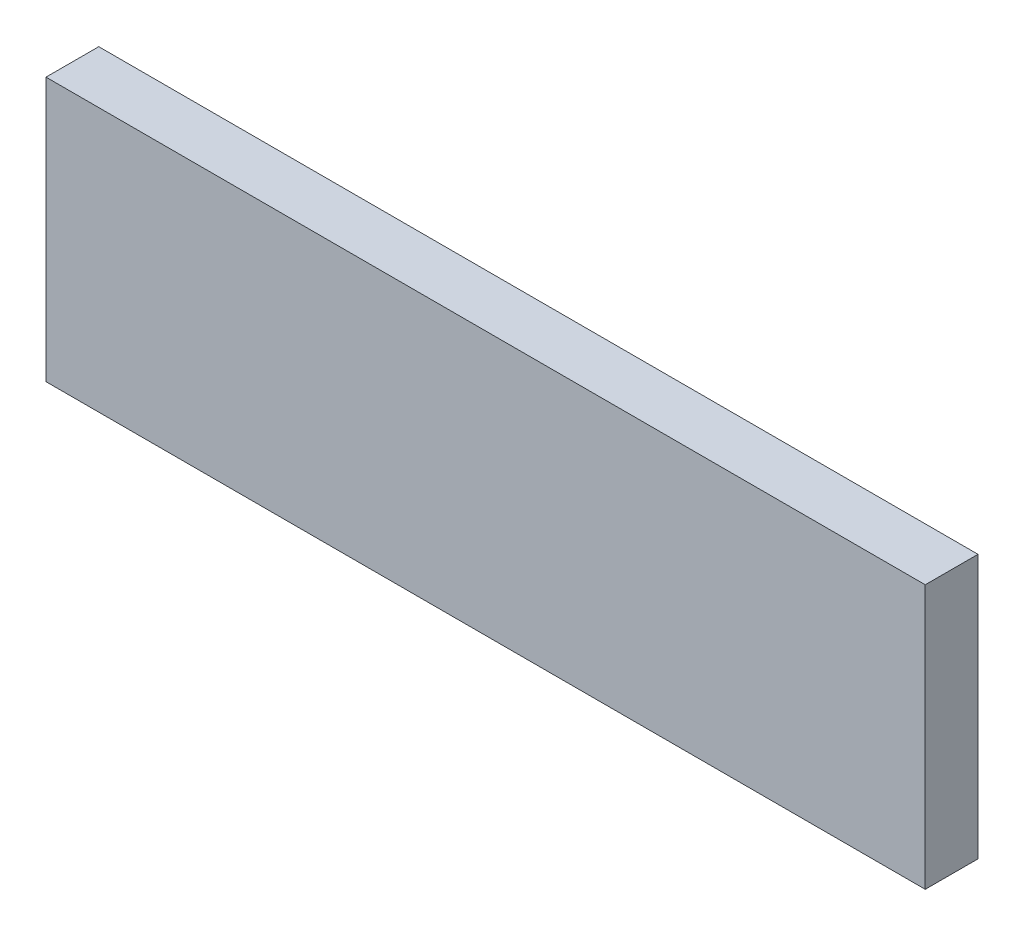
ISO-10303-21;
HEADER;
FILE_DESCRIPTION(('STEP AP214'),'2;1');
FILE_NAME('part.step','',(''),(''),'','','');
FILE_SCHEMA(('AUTOMOTIVE_DESIGN { 1 0 10303 214 1 1 1 1 }'));
ENDSEC;
DATA;
#1=APPLICATION_CONTEXT('core data for automotive mechanical design processes');
#2=APPLICATION_PROTOCOL_DEFINITION('international standard','automotive_design',2000,#1);
#3=PRODUCT_CONTEXT('',#1,'mechanical');
#4=PRODUCT('Part','Part','',(#3));
#5=PRODUCT_RELATED_PRODUCT_CATEGORY('part','',(#4));
#6=PRODUCT_DEFINITION_FORMATION('','',#4);
#7=PRODUCT_DEFINITION_CONTEXT('part definition',#1,'design');
#8=PRODUCT_DEFINITION('design','',#6,#7);
#9=PRODUCT_DEFINITION_SHAPE('','',#8);
#10=(LENGTH_UNIT() NAMED_UNIT(*) SI_UNIT(.MILLI.,.METRE.));
#11=(NAMED_UNIT(*) PLANE_ANGLE_UNIT() SI_UNIT($,.RADIAN.));
#12=(NAMED_UNIT(*) SI_UNIT($,.STERADIAN.) SOLID_ANGLE_UNIT());
#13=UNCERTAINTY_MEASURE_WITH_UNIT(LENGTH_MEASURE(1.E-05),#10,'distance_accuracy_value','');
#14=(GEOMETRIC_REPRESENTATION_CONTEXT(3) GLOBAL_UNCERTAINTY_ASSIGNED_CONTEXT((#13)) GLOBAL_UNIT_ASSIGNED_CONTEXT((#10,
#11,#12)) REPRESENTATION_CONTEXT('',''));
#15=CARTESIAN_POINT('',(0.,0.,0.));
#16=DIRECTION('',(0.,0.,1.));
#17=DIRECTION('',(1.,0.,0.));
#18=AXIS2_PLACEMENT_3D('',#15,#16,#17);
#19=CARTESIAN_POINT('',(0.,0.,6.));
#20=DIRECTION('',(1.,0.,0.));
#21=DIRECTION('',(0.,0.,-1.));
#22=AXIS2_PLACEMENT_3D('',#19,#20,#21);
#23=PLANE('',#22);
#24=DIRECTION('',(0.,-1.,0.));
#25=VECTOR('',#24,1.);
#26=CARTESIAN_POINT('',(0.,0.,0.));
#27=LINE('',#26,#25);
#28=CARTESIAN_POINT('',(0.,30.,0.));
#29=VERTEX_POINT('',#28);
#30=CARTESIAN_POINT('',(0.,0.,0.));
#31=VERTEX_POINT('',#30);
#32=EDGE_CURVE('E107',#29,#31,#27,.T.);
#33=ORIENTED_EDGE('',*,*,#32,.T.);
#34=DIRECTION('',(0.,0.,-1.));
#35=VECTOR('',#34,1.);
#36=CARTESIAN_POINT('',(0.,0.,6.));
#37=LINE('',#36,#35);
#38=CARTESIAN_POINT('',(0.,0.,6.));
#39=VERTEX_POINT('',#38);
#40=EDGE_CURVE('E11',#39,#31,#37,.T.);
#41=ORIENTED_EDGE('',*,*,#40,.F.);
#42=DIRECTION('',(0.,-1.,0.));
#43=VECTOR('',#42,1.);
#44=CARTESIAN_POINT('',(0.,0.,6.));
#45=LINE('',#44,#43);
#46=CARTESIAN_POINT('',(0.,30.,6.));
#47=VERTEX_POINT('',#46);
#48=EDGE_CURVE('E91',#47,#39,#45,.T.);
#49=ORIENTED_EDGE('',*,*,#48,.F.);
#50=DIRECTION('',(0.,0.,-1.));
#51=VECTOR('',#50,1.);
#52=CARTESIAN_POINT('',(0.,30.,6.));
#53=LINE('',#52,#51);
#54=EDGE_CURVE('E103',#47,#29,#53,.T.);
#55=ORIENTED_EDGE('',*,*,#54,.T.);
#56=EDGE_LOOP('',(#33,#41,#49,#55));
#57=FACE_BOUND('',#56,.T.);
#58=ADVANCED_FACE('F39',(#57),#23,.F.);
#59=CARTESIAN_POINT('',(0.,0.,6.));
#60=DIRECTION('',(0.,1.,0.));
#61=DIRECTION('',(0.,0.,1.));
#62=AXIS2_PLACEMENT_3D('',#59,#60,#61);
#63=PLANE('',#62);
#64=DIRECTION('',(1.,0.,0.));
#65=VECTOR('',#64,1.);
#66=CARTESIAN_POINT('',(0.,0.,0.));
#67=LINE('',#66,#65);
#68=CARTESIAN_POINT('',(100.,0.,0.));
#69=VERTEX_POINT('',#68);
#70=EDGE_CURVE('E96',#31,#69,#67,.T.);
#71=ORIENTED_EDGE('',*,*,#70,.T.);
#72=DIRECTION('',(0.,0.,-1.));
#73=VECTOR('',#72,1.);
#74=CARTESIAN_POINT('',(100.,0.,6.));
#75=LINE('',#74,#73);
#76=CARTESIAN_POINT('',(100.,0.,6.));
#77=VERTEX_POINT('',#76);
#78=EDGE_CURVE('E48',#77,#69,#75,.T.);
#79=ORIENTED_EDGE('',*,*,#78,.F.);
#80=DIRECTION('',(1.,0.,0.));
#81=VECTOR('',#80,1.);
#82=CARTESIAN_POINT('',(0.,0.,6.));
#83=LINE('',#82,#81);
#84=EDGE_CURVE('E86',#39,#77,#83,.T.);
#85=ORIENTED_EDGE('',*,*,#84,.F.);
#86=ORIENTED_EDGE('',*,*,#40,.T.);
#87=EDGE_LOOP('',(#71,#79,#85,#86));
#88=FACE_BOUND('',#87,.T.);
#89=ADVANCED_FACE('F95',(#88),#63,.F.);
#90=CARTESIAN_POINT('',(100.,0.,6.));
#91=DIRECTION('',(-1.,0.,0.));
#92=DIRECTION('',(0.,0.,1.));
#93=AXIS2_PLACEMENT_3D('',#90,#91,#92);
#94=PLANE('',#93);
#95=DIRECTION('',(0.,1.,0.));
#96=VECTOR('',#95,1.);
#97=CARTESIAN_POINT('',(100.,0.,0.));
#98=LINE('',#97,#96);
#99=CARTESIAN_POINT('',(100.,30.,0.));
#100=VERTEX_POINT('',#99);
#101=EDGE_CURVE('E73',#69,#100,#98,.T.);
#102=ORIENTED_EDGE('',*,*,#101,.T.);
#103=DIRECTION('',(0.,0.,-1.));
#104=VECTOR('',#103,1.);
#105=CARTESIAN_POINT('',(100.,30.,6.));
#106=LINE('',#105,#104);
#107=CARTESIAN_POINT('',(100.,30.,6.));
#108=VERTEX_POINT('',#107);
#109=EDGE_CURVE('E98',#108,#100,#106,.T.);
#110=ORIENTED_EDGE('',*,*,#109,.F.);
#111=DIRECTION('',(0.,1.,0.));
#112=VECTOR('',#111,1.);
#113=CARTESIAN_POINT('',(100.,0.,6.));
#114=LINE('',#113,#112);
#115=EDGE_CURVE('E89',#77,#108,#114,.T.);
#116=ORIENTED_EDGE('',*,*,#115,.F.);
#117=ORIENTED_EDGE('',*,*,#78,.T.);
#118=EDGE_LOOP('',(#102,#110,#116,#117));
#119=FACE_BOUND('',#118,.T.);
#120=ADVANCED_FACE('F99',(#119),#94,.F.);
#121=CARTESIAN_POINT('',(0.,30.,6.));
#122=DIRECTION('',(0.,-1.,0.));
#123=DIRECTION('',(0.,0.,-1.));
#124=AXIS2_PLACEMENT_3D('',#121,#122,#123);
#125=PLANE('',#124);
#126=DIRECTION('',(-1.,0.,0.));
#127=VECTOR('',#126,1.);
#128=CARTESIAN_POINT('',(0.,30.,0.));
#129=LINE('',#128,#127);
#130=EDGE_CURVE('E79',#100,#29,#129,.T.);
#131=ORIENTED_EDGE('',*,*,#130,.T.);
#132=ORIENTED_EDGE('',*,*,#54,.F.);
#133=DIRECTION('',(-1.,0.,0.));
#134=VECTOR('',#133,1.);
#135=CARTESIAN_POINT('',(0.,30.,6.));
#136=LINE('',#135,#134);
#137=EDGE_CURVE('E56',#108,#47,#136,.T.);
#138=ORIENTED_EDGE('',*,*,#137,.F.);
#139=ORIENTED_EDGE('',*,*,#109,.T.);
#140=EDGE_LOOP('',(#131,#132,#138,#139));
#141=FACE_BOUND('',#140,.T.);
#142=ADVANCED_FACE('F120',(#141),#125,.F.);
#143=CARTESIAN_POINT('',(0.,0.,6.));
#144=DIRECTION('',(0.,0.,-1.));
#145=DIRECTION('',(-1.,0.,0.));
#146=AXIS2_PLACEMENT_3D('',#143,#144,#145);
#147=PLANE('',#146);
#148=ORIENTED_EDGE('',*,*,#48,.T.);
#149=ORIENTED_EDGE('',*,*,#84,.T.);
#150=ORIENTED_EDGE('',*,*,#115,.T.);
#151=ORIENTED_EDGE('',*,*,#137,.T.);
#152=EDGE_LOOP('',(#148,#149,#150,#151));
#153=FACE_BOUND('',#152,.T.);
#154=ADVANCED_FACE('F87',(#153),#147,.F.);
#155=CARTESIAN_POINT('',(0.,0.,0.));
#156=DIRECTION('',(0.,0.,-1.));
#157=DIRECTION('',(-1.,0.,0.));
#158=AXIS2_PLACEMENT_3D('',#155,#156,#157);
#159=PLANE('',#158);
#160=ORIENTED_EDGE('',*,*,#32,.F.);
#161=ORIENTED_EDGE('',*,*,#130,.F.);
#162=ORIENTED_EDGE('',*,*,#101,.F.);
#163=ORIENTED_EDGE('',*,*,#70,.F.);
#164=EDGE_LOOP('',(#160,#161,#162,#163));
#165=FACE_BOUND('',#164,.T.);
#166=ADVANCED_FACE('F123',(#165),#159,.T.);
#167=CLOSED_SHELL('',(#58,#89,#120,#142,#154,#166));
#168=MANIFOLD_SOLID_BREP('B2',#167);
#169=ADVANCED_BREP_SHAPE_REPRESENTATION('',(#18,#168),#14);
#170=SHAPE_DEFINITION_REPRESENTATION(#9,#169);
ENDSEC;
END-ISO-10303-21;
